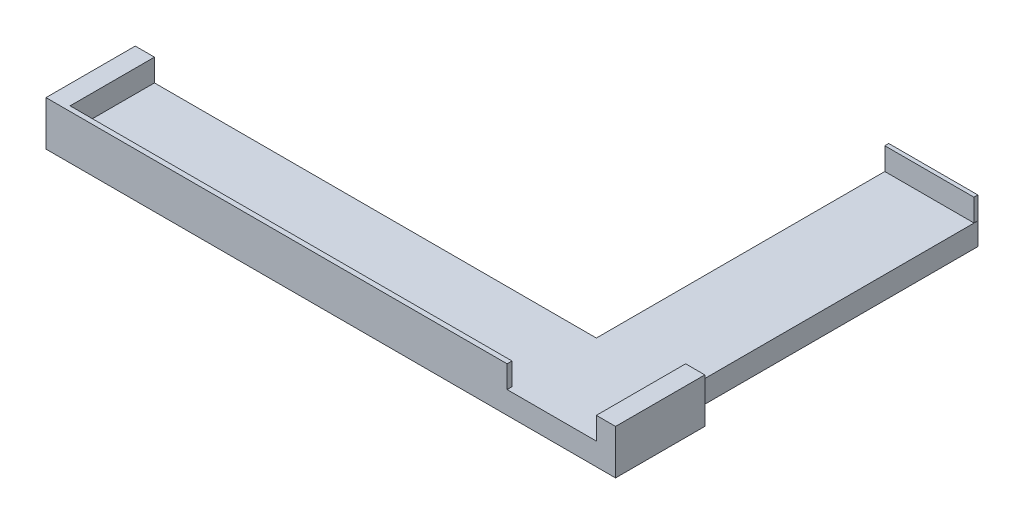
ISO-10303-21;
HEADER;
FILE_DESCRIPTION(('STEP AP214'),'2;1');
FILE_NAME('part.step','',(''),(''),'','','');
FILE_SCHEMA(('AUTOMOTIVE_DESIGN { 1 0 10303 214 1 1 1 1 }'));
ENDSEC;
DATA;
#1=APPLICATION_CONTEXT('core data for automotive mechanical design processes');
#2=APPLICATION_PROTOCOL_DEFINITION('international standard','automotive_design',2000,#1);
#3=PRODUCT_CONTEXT('',#1,'mechanical');
#4=PRODUCT('Part','Part','',(#3));
#5=PRODUCT_RELATED_PRODUCT_CATEGORY('part','',(#4));
#6=PRODUCT_DEFINITION_FORMATION('','',#4);
#7=PRODUCT_DEFINITION_CONTEXT('part definition',#1,'design');
#8=PRODUCT_DEFINITION('design','',#6,#7);
#9=PRODUCT_DEFINITION_SHAPE('','',#8);
#10=(LENGTH_UNIT() NAMED_UNIT(*) SI_UNIT(.MILLI.,.METRE.));
#11=(NAMED_UNIT(*) PLANE_ANGLE_UNIT() SI_UNIT($,.RADIAN.));
#12=(NAMED_UNIT(*) SI_UNIT($,.STERADIAN.) SOLID_ANGLE_UNIT());
#13=UNCERTAINTY_MEASURE_WITH_UNIT(LENGTH_MEASURE(1.E-05),#10,'distance_accuracy_value','');
#14=(GEOMETRIC_REPRESENTATION_CONTEXT(3) GLOBAL_UNCERTAINTY_ASSIGNED_CONTEXT((#13)) GLOBAL_UNIT_ASSIGNED_CONTEXT((#10,
#11,#12)) REPRESENTATION_CONTEXT('',''));
#15=CARTESIAN_POINT('',(0.,0.,0.));
#16=DIRECTION('',(0.,0.,1.));
#17=DIRECTION('',(1.,0.,0.));
#18=AXIS2_PLACEMENT_3D('',#15,#16,#17);
#19=CARTESIAN_POINT('',(59.5,5.,0.));
#20=DIRECTION('',(1.,0.,0.));
#21=DIRECTION('',(0.,0.,-1.));
#22=AXIS2_PLACEMENT_3D('',#19,#20,#21);
#23=PLANE('',#22);
#24=DIRECTION('',(0.,0.,1.));
#25=VECTOR('',#24,1.);
#26=CARTESIAN_POINT('',(59.5,5.,0.));
#27=LINE('',#26,#25);
#28=CARTESIAN_POINT('',(59.5,5.,-75.5));
#29=VERTEX_POINT('',#28);
#30=CARTESIAN_POINT('',(59.5,5.,-10.));
#31=VERTEX_POINT('',#30);
#32=EDGE_CURVE('E228',#29,#31,#27,.T.);
#33=ORIENTED_EDGE('',*,*,#32,.T.);
#34=DIRECTION('',(0.,-1.,0.));
#35=VECTOR('',#34,1.);
#36=CARTESIAN_POINT('',(59.5,10.,-10.));
#37=LINE('',#36,#35);
#38=CARTESIAN_POINT('',(59.5,0.,-10.));
#39=VERTEX_POINT('',#38);
#40=EDGE_CURVE('E11',#31,#39,#37,.T.);
#41=ORIENTED_EDGE('',*,*,#40,.T.);
#42=DIRECTION('',(0.,0.,1.));
#43=VECTOR('',#42,1.);
#44=CARTESIAN_POINT('',(59.5,0.,0.));
#45=LINE('',#44,#43);
#46=CARTESIAN_POINT('',(59.5,0.,-75.5));
#47=VERTEX_POINT('',#46);
#48=EDGE_CURVE('E216',#47,#39,#45,.T.);
#49=ORIENTED_EDGE('',*,*,#48,.F.);
#50=DIRECTION('',(0.,-1.,0.));
#51=VECTOR('',#50,1.);
#52=CARTESIAN_POINT('',(59.5,5.,-75.5));
#53=LINE('',#52,#51);
#54=EDGE_CURVE('E253',#29,#47,#53,.T.);
#55=ORIENTED_EDGE('',*,*,#54,.F.);
#56=EDGE_LOOP('',(#33,#41,#49,#55));
#57=FACE_BOUND('',#56,.T.);
#58=ADVANCED_FACE('F41',(#57),#23,.T.);
#59=CARTESIAN_POINT('',(-59.5,10.,0.));
#60=DIRECTION('',(1.,0.,0.));
#61=DIRECTION('',(0.,0.,-1.));
#62=AXIS2_PLACEMENT_3D('',#59,#60,#61);
#63=PLANE('',#62);
#64=DIRECTION('',(0.,0.,1.));
#65=VECTOR('',#64,1.);
#66=CARTESIAN_POINT('',(-59.5,5.,0.));
#67=LINE('',#66,#65);
#68=CARTESIAN_POINT('',(-59.5,5.,-10.));
#69=VERTEX_POINT('',#68);
#70=CARTESIAN_POINT('',(-59.5,5.,8.90022315167097));
#71=VERTEX_POINT('',#70);
#72=EDGE_CURVE('E65',#69,#71,#67,.T.);
#73=ORIENTED_EDGE('',*,*,#72,.F.);
#74=DIRECTION('',(0.,-1.,0.));
#75=VECTOR('',#74,1.);
#76=CARTESIAN_POINT('',(-59.5,10.,-10.));
#77=LINE('',#76,#75);
#78=CARTESIAN_POINT('',(-59.5,10.,-10.));
#79=VERTEX_POINT('',#78);
#80=EDGE_CURVE('E45',#79,#69,#77,.T.);
#81=ORIENTED_EDGE('',*,*,#80,.F.);
#82=DIRECTION('',(0.,0.,1.));
#83=VECTOR('',#82,1.);
#84=CARTESIAN_POINT('',(-59.5,10.,0.));
#85=LINE('',#84,#83);
#86=CARTESIAN_POINT('',(-59.5,10.,8.90022315167097));
#87=VERTEX_POINT('',#86);
#88=EDGE_CURVE('E256',#79,#87,#85,.T.);
#89=ORIENTED_EDGE('',*,*,#88,.T.);
#90=DIRECTION('',(0.,-1.,0.));
#91=VECTOR('',#90,1.);
#92=CARTESIAN_POINT('',(-59.5,10.,8.90022315167097));
#93=LINE('',#92,#91);
#94=EDGE_CURVE('E273',#87,#71,#93,.T.);
#95=ORIENTED_EDGE('',*,*,#94,.T.);
#96=EDGE_LOOP('',(#73,#81,#89,#95));
#97=FACE_BOUND('',#96,.T.);
#98=ADVANCED_FACE('F43',(#97),#63,.T.);
#99=CARTESIAN_POINT('',(0.,10.,-10.));
#100=DIRECTION('',(0.,0.,-1.));
#101=DIRECTION('',(-1.,0.,0.));
#102=AXIS2_PLACEMENT_3D('',#99,#100,#101);
#103=PLANE('',#102);
#104=DIRECTION('',(1.,0.,0.));
#105=VECTOR('',#104,1.);
#106=CARTESIAN_POINT('',(0.,0.,-10.));
#107=LINE('',#106,#105);
#108=CARTESIAN_POINT('',(-63.8,0.,-10.));
#109=VERTEX_POINT('',#108);
#110=CARTESIAN_POINT('',(39.5,0.,-10.));
#111=VERTEX_POINT('',#110);
#112=EDGE_CURVE('E255',#109,#111,#107,.T.);
#113=ORIENTED_EDGE('',*,*,#112,.F.);
#114=DIRECTION('',(0.,-1.,0.));
#115=VECTOR('',#114,1.);
#116=CARTESIAN_POINT('',(-63.8,10.,-10.));
#117=LINE('',#116,#115);
#118=CARTESIAN_POINT('',(-63.8,10.,-10.));
#119=VERTEX_POINT('',#118);
#120=EDGE_CURVE('E286',#119,#109,#117,.T.);
#121=ORIENTED_EDGE('',*,*,#120,.F.);
#122=DIRECTION('',(1.,0.,0.));
#123=VECTOR('',#122,1.);
#124=CARTESIAN_POINT('',(0.,10.,-10.));
#125=LINE('',#124,#123);
#126=EDGE_CURVE('E259',#119,#79,#125,.T.);
#127=ORIENTED_EDGE('',*,*,#126,.T.);
#128=ORIENTED_EDGE('',*,*,#80,.T.);
#129=DIRECTION('',(1.,0.,0.));
#130=VECTOR('',#129,1.);
#131=CARTESIAN_POINT('',(0.,5.,-10.));
#132=LINE('',#131,#130);
#133=CARTESIAN_POINT('',(39.5,5.,-10.));
#134=VERTEX_POINT('',#133);
#135=EDGE_CURVE('E240',#69,#134,#132,.T.);
#136=ORIENTED_EDGE('',*,*,#135,.T.);
#137=DIRECTION('',(0.,-1.,0.));
#138=VECTOR('',#137,1.);
#139=CARTESIAN_POINT('',(39.5,5.,-10.));
#140=LINE('',#139,#138);
#141=EDGE_CURVE('E243',#134,#111,#140,.T.);
#142=ORIENTED_EDGE('',*,*,#141,.T.);
#143=EDGE_LOOP('',(#113,#121,#127,#128,#136,#142));
#144=FACE_BOUND('',#143,.T.);
#145=ADVANCED_FACE('F292',(#144),#103,.T.);
#146=CARTESIAN_POINT('',(-63.8,10.,0.));
#147=DIRECTION('',(-1.,0.,0.));
#148=DIRECTION('',(0.,0.,1.));
#149=AXIS2_PLACEMENT_3D('',#146,#147,#148);
#150=PLANE('',#149);
#151=DIRECTION('',(0.,0.,-1.));
#152=VECTOR('',#151,1.);
#153=CARTESIAN_POINT('',(-63.8,0.,0.));
#154=LINE('',#153,#152);
#155=CARTESIAN_POINT('',(-63.8,0.,10.));
#156=VERTEX_POINT('',#155);
#157=EDGE_CURVE('E275',#156,#109,#154,.T.);
#158=ORIENTED_EDGE('',*,*,#157,.F.);
#159=DIRECTION('',(0.,-1.,0.));
#160=VECTOR('',#159,1.);
#161=CARTESIAN_POINT('',(-63.8,10.,10.));
#162=LINE('',#161,#160);
#163=CARTESIAN_POINT('',(-63.8,10.,10.));
#164=VERTEX_POINT('',#163);
#165=EDGE_CURVE('E285',#164,#156,#162,.T.);
#166=ORIENTED_EDGE('',*,*,#165,.F.);
#167=DIRECTION('',(0.,0.,-1.));
#168=VECTOR('',#167,1.);
#169=CARTESIAN_POINT('',(-63.8,10.,0.));
#170=LINE('',#169,#168);
#171=EDGE_CURVE('E263',#164,#119,#170,.T.);
#172=ORIENTED_EDGE('',*,*,#171,.T.);
#173=ORIENTED_EDGE('',*,*,#120,.T.);
#174=EDGE_LOOP('',(#158,#166,#172,#173));
#175=FACE_BOUND('',#174,.T.);
#176=ADVANCED_FACE('F310',(#175),#150,.T.);
#177=CARTESIAN_POINT('',(0.,10.,10.));
#178=DIRECTION('',(0.,0.,-1.));
#179=DIRECTION('',(-1.,0.,0.));
#180=AXIS2_PLACEMENT_3D('',#177,#178,#179);
#181=PLANE('',#180);
#182=DIRECTION('',(1.,0.,0.));
#183=VECTOR('',#182,1.);
#184=CARTESIAN_POINT('',(0.,0.,10.));
#185=LINE('',#184,#183);
#186=CARTESIAN_POINT('',(63.8,0.,10.));
#187=VERTEX_POINT('',#186);
#188=EDGE_CURVE('E260',#156,#187,#185,.T.);
#189=ORIENTED_EDGE('',*,*,#188,.T.);
#190=DIRECTION('',(0.,-1.,0.));
#191=VECTOR('',#190,1.);
#192=CARTESIAN_POINT('',(63.8,10.,10.));
#193=LINE('',#192,#191);
#194=CARTESIAN_POINT('',(63.8,10.,10.));
#195=VERTEX_POINT('',#194);
#196=EDGE_CURVE('E209',#195,#187,#193,.T.);
#197=ORIENTED_EDGE('',*,*,#196,.F.);
#198=DIRECTION('',(1.,0.,0.));
#199=VECTOR('',#198,1.);
#200=CARTESIAN_POINT('',(0.,10.,10.));
#201=LINE('',#200,#199);
#202=CARTESIAN_POINT('',(59.5,10.,10.));
#203=VERTEX_POINT('',#202);
#204=EDGE_CURVE('E200',#203,#195,#201,.T.);
#205=ORIENTED_EDGE('',*,*,#204,.F.);
#206=DIRECTION('',(0.,-1.,0.));
#207=VECTOR('',#206,1.);
#208=CARTESIAN_POINT('',(59.5,10.,10.));
#209=LINE('',#208,#207);
#210=CARTESIAN_POINT('',(59.5,5.,10.));
#211=VERTEX_POINT('',#210);
#212=EDGE_CURVE('E212',#203,#211,#209,.T.);
#213=ORIENTED_EDGE('',*,*,#212,.T.);
#214=DIRECTION('',(1.,0.,0.));
#215=VECTOR('',#214,1.);
#216=CARTESIAN_POINT('',(0.,5.,10.));
#217=LINE('',#216,#215);
#218=CARTESIAN_POINT('',(39.5,5.,10.));
#219=VERTEX_POINT('',#218);
#220=EDGE_CURVE('E224',#219,#211,#217,.T.);
#221=ORIENTED_EDGE('',*,*,#220,.F.);
#222=DIRECTION('',(0.,-1.,0.));
#223=VECTOR('',#222,1.);
#224=CARTESIAN_POINT('',(39.5,10.,10.));
#225=LINE('',#224,#223);
#226=CARTESIAN_POINT('',(39.5,10.,10.));
#227=VERTEX_POINT('',#226);
#228=EDGE_CURVE('E283',#227,#219,#225,.T.);
#229=ORIENTED_EDGE('',*,*,#228,.F.);
#230=DIRECTION('',(1.,0.,0.));
#231=VECTOR('',#230,1.);
#232=CARTESIAN_POINT('',(0.,10.,10.));
#233=LINE('',#232,#231);
#234=EDGE_CURVE('E266',#164,#227,#233,.T.);
#235=ORIENTED_EDGE('',*,*,#234,.F.);
#236=ORIENTED_EDGE('',*,*,#165,.T.);
#237=EDGE_LOOP('',(#189,#197,#205,#213,#221,#229,#235,#236));
#238=FACE_BOUND('',#237,.T.);
#239=ADVANCED_FACE('F314',(#238),#181,.F.);
#240=CARTESIAN_POINT('',(39.5,10.,0.));
#241=DIRECTION('',(-1.,0.,0.));
#242=DIRECTION('',(0.,0.,1.));
#243=AXIS2_PLACEMENT_3D('',#240,#241,#242);
#244=PLANE('',#243);
#245=ORIENTED_EDGE('',*,*,#228,.T.);
#246=DIRECTION('',(0.,0.,-1.));
#247=VECTOR('',#246,1.);
#248=CARTESIAN_POINT('',(39.5,5.,0.));
#249=LINE('',#248,#247);
#250=CARTESIAN_POINT('',(39.5,5.,8.90022315167097));
#251=VERTEX_POINT('',#250);
#252=EDGE_CURVE('E222',#219,#251,#249,.T.);
#253=ORIENTED_EDGE('',*,*,#252,.T.);
#254=DIRECTION('',(0.,-1.,0.));
#255=VECTOR('',#254,1.);
#256=CARTESIAN_POINT('',(39.5,10.,8.90022315167097));
#257=LINE('',#256,#255);
#258=CARTESIAN_POINT('',(39.5,10.,8.90022315167097));
#259=VERTEX_POINT('',#258);
#260=EDGE_CURVE('E280',#259,#251,#257,.T.);
#261=ORIENTED_EDGE('',*,*,#260,.F.);
#262=DIRECTION('',(0.,0.,-1.));
#263=VECTOR('',#262,1.);
#264=CARTESIAN_POINT('',(39.5,10.,0.));
#265=LINE('',#264,#263);
#266=EDGE_CURVE('E268',#227,#259,#265,.T.);
#267=ORIENTED_EDGE('',*,*,#266,.F.);
#268=EDGE_LOOP('',(#245,#253,#261,#267));
#269=FACE_BOUND('',#268,.T.);
#270=ADVANCED_FACE('F319',(#269),#244,.F.);
#271=CARTESIAN_POINT('',(0.,10.,8.90022315167097));
#272=DIRECTION('',(0.,0.,-1.));
#273=DIRECTION('',(-1.,0.,0.));
#274=AXIS2_PLACEMENT_3D('',#271,#272,#273);
#275=PLANE('',#274);
#276=DIRECTION('',(1.,0.,0.));
#277=VECTOR('',#276,1.);
#278=CARTESIAN_POINT('',(0.,5.,8.90022315167097));
#279=LINE('',#278,#277);
#280=EDGE_CURVE('E218',#71,#251,#279,.T.);
#281=ORIENTED_EDGE('',*,*,#280,.F.);
#282=ORIENTED_EDGE('',*,*,#94,.F.);
#283=DIRECTION('',(1.,0.,0.));
#284=VECTOR('',#283,1.);
#285=CARTESIAN_POINT('',(0.,10.,8.90022315167097));
#286=LINE('',#285,#284);
#287=EDGE_CURVE('E270',#87,#259,#286,.T.);
#288=ORIENTED_EDGE('',*,*,#287,.T.);
#289=ORIENTED_EDGE('',*,*,#260,.T.);
#290=EDGE_LOOP('',(#281,#282,#288,#289));
#291=FACE_BOUND('',#290,.T.);
#292=ADVANCED_FACE('F322',(#291),#275,.T.);
#293=CARTESIAN_POINT('',(0.,10.,0.));
#294=DIRECTION('',(0.,1.,0.));
#295=DIRECTION('',(0.,0.,1.));
#296=AXIS2_PLACEMENT_3D('',#293,#294,#295);
#297=PLANE('',#296);
#298=ORIENTED_EDGE('',*,*,#88,.F.);
#299=ORIENTED_EDGE('',*,*,#126,.F.);
#300=ORIENTED_EDGE('',*,*,#171,.F.);
#301=ORIENTED_EDGE('',*,*,#234,.T.);
#302=ORIENTED_EDGE('',*,*,#266,.T.);
#303=ORIENTED_EDGE('',*,*,#287,.F.);
#304=EDGE_LOOP('',(#298,#299,#300,#301,#302,#303));
#305=FACE_BOUND('',#304,.T.);
#306=ADVANCED_FACE('F308',(#305),#297,.T.);
#307=CARTESIAN_POINT('',(0.,0.,0.));
#308=DIRECTION('',(0.,1.,0.));
#309=DIRECTION('',(0.,0.,1.));
#310=AXIS2_PLACEMENT_3D('',#307,#308,#309);
#311=PLANE('',#310);
#312=ORIENTED_EDGE('',*,*,#112,.T.);
#313=DIRECTION('',(0.,0.,-1.));
#314=VECTOR('',#313,1.);
#315=CARTESIAN_POINT('',(39.5,0.,0.));
#316=LINE('',#315,#314);
#317=CARTESIAN_POINT('',(39.5,0.,-75.5));
#318=VERTEX_POINT('',#317);
#319=EDGE_CURVE('E219',#111,#318,#316,.T.);
#320=ORIENTED_EDGE('',*,*,#319,.T.);
#321=DIRECTION('',(1.,0.,0.));
#322=VECTOR('',#321,1.);
#323=CARTESIAN_POINT('',(0.,0.,-75.5));
#324=LINE('',#323,#322);
#325=EDGE_CURVE('E246',#318,#47,#324,.T.);
#326=ORIENTED_EDGE('',*,*,#325,.T.);
#327=ORIENTED_EDGE('',*,*,#48,.T.);
#328=DIRECTION('',(1.,0.,0.));
#329=VECTOR('',#328,1.);
#330=CARTESIAN_POINT('',(0.,0.,-10.));
#331=LINE('',#330,#329);
#332=CARTESIAN_POINT('',(63.8,0.,-10.));
#333=VERTEX_POINT('',#332);
#334=EDGE_CURVE('E58',#39,#333,#331,.T.);
#335=ORIENTED_EDGE('',*,*,#334,.T.);
#336=DIRECTION('',(0.,0.,-1.));
#337=VECTOR('',#336,1.);
#338=CARTESIAN_POINT('',(63.8,0.,0.));
#339=LINE('',#338,#337);
#340=EDGE_CURVE('E198',#187,#333,#339,.T.);
#341=ORIENTED_EDGE('',*,*,#340,.F.);
#342=ORIENTED_EDGE('',*,*,#188,.F.);
#343=ORIENTED_EDGE('',*,*,#157,.T.);
#344=EDGE_LOOP('',(#312,#320,#326,#327,#335,#341,#342,#343));
#345=FACE_BOUND('',#344,.T.);
#346=ADVANCED_FACE('F304',(#345),#311,.F.);
#347=CARTESIAN_POINT('',(0.,5.,-75.5));
#348=DIRECTION('',(0.,0.,-1.));
#349=DIRECTION('',(-1.,0.,0.));
#350=AXIS2_PLACEMENT_3D('',#347,#348,#349);
#351=PLANE('',#350);
#352=ORIENTED_EDGE('',*,*,#325,.F.);
#353=DIRECTION('',(0.,-1.,0.));
#354=VECTOR('',#353,1.);
#355=CARTESIAN_POINT('',(39.5,10.,-75.5));
#356=LINE('',#355,#354);
#357=CARTESIAN_POINT('',(39.5,10.,-75.5));
#358=VERTEX_POINT('',#357);
#359=EDGE_CURVE('E169',#358,#318,#356,.T.);
#360=ORIENTED_EDGE('',*,*,#359,.F.);
#361=DIRECTION('',(1.,0.,0.));
#362=VECTOR('',#361,1.);
#363=CARTESIAN_POINT('',(0.,10.,-75.5));
#364=LINE('',#363,#362);
#365=CARTESIAN_POINT('',(59.4687435036804,10.,-75.5));
#366=VERTEX_POINT('',#365);
#367=EDGE_CURVE('E175',#358,#366,#364,.T.);
#368=ORIENTED_EDGE('',*,*,#367,.T.);
#369=DIRECTION('',(0.,-1.,0.));
#370=VECTOR('',#369,1.);
#371=CARTESIAN_POINT('',(59.4687435036804,10.,-75.5));
#372=LINE('',#371,#370);
#373=CARTESIAN_POINT('',(59.4687435036804,5.,-75.5));
#374=VERTEX_POINT('',#373);
#375=EDGE_CURVE('E160',#366,#374,#372,.T.);
#376=ORIENTED_EDGE('',*,*,#375,.T.);
#377=DIRECTION('',(1.,0.,0.));
#378=VECTOR('',#377,1.);
#379=CARTESIAN_POINT('',(0.,5.,-75.5));
#380=LINE('',#379,#378);
#381=EDGE_CURVE('E231',#374,#29,#380,.T.);
#382=ORIENTED_EDGE('',*,*,#381,.T.);
#383=ORIENTED_EDGE('',*,*,#54,.T.);
#384=EDGE_LOOP('',(#352,#360,#368,#376,#382,#383));
#385=FACE_BOUND('',#384,.T.);
#386=ADVANCED_FACE('F181',(#385),#351,.T.);
#387=CARTESIAN_POINT('',(39.5,5.,0.));
#388=DIRECTION('',(-1.,0.,0.));
#389=DIRECTION('',(0.,0.,1.));
#390=AXIS2_PLACEMENT_3D('',#387,#388,#389);
#391=PLANE('',#390);
#392=ORIENTED_EDGE('',*,*,#319,.F.);
#393=ORIENTED_EDGE('',*,*,#141,.F.);
#394=DIRECTION('',(0.,0.,-1.));
#395=VECTOR('',#394,1.);
#396=CARTESIAN_POINT('',(39.5,5.,0.));
#397=LINE('',#396,#395);
#398=CARTESIAN_POINT('',(39.5,5.,-74.6204127895139));
#399=VERTEX_POINT('',#398);
#400=EDGE_CURVE('E237',#134,#399,#397,.T.);
#401=ORIENTED_EDGE('',*,*,#400,.T.);
#402=DIRECTION('',(0.,-1.,0.));
#403=VECTOR('',#402,1.);
#404=CARTESIAN_POINT('',(39.5,10.,-74.6204127895139));
#405=LINE('',#404,#403);
#406=CARTESIAN_POINT('',(39.5,10.,-74.6204127895139));
#407=VERTEX_POINT('',#406);
#408=EDGE_CURVE('E190',#407,#399,#405,.T.);
#409=ORIENTED_EDGE('',*,*,#408,.F.);
#410=DIRECTION('',(0.,0.,-1.));
#411=VECTOR('',#410,1.);
#412=CARTESIAN_POINT('',(39.5,10.,0.));
#413=LINE('',#412,#411);
#414=EDGE_CURVE('E183',#407,#358,#413,.T.);
#415=ORIENTED_EDGE('',*,*,#414,.T.);
#416=ORIENTED_EDGE('',*,*,#359,.T.);
#417=EDGE_LOOP('',(#392,#393,#401,#409,#415,#416));
#418=FACE_BOUND('',#417,.T.);
#419=ADVANCED_FACE('F300',(#418),#391,.T.);
#420=CARTESIAN_POINT('',(0.,5.,0.));
#421=DIRECTION('',(0.,1.,0.));
#422=DIRECTION('',(0.,0.,1.));
#423=AXIS2_PLACEMENT_3D('',#420,#421,#422);
#424=PLANE('',#423);
#425=ORIENTED_EDGE('',*,*,#72,.T.);
#426=ORIENTED_EDGE('',*,*,#280,.T.);
#427=ORIENTED_EDGE('',*,*,#252,.F.);
#428=ORIENTED_EDGE('',*,*,#220,.T.);
#429=EDGE_CURVE('E227',#31,#211,#27,.T.);
#430=ORIENTED_EDGE('',*,*,#429,.F.);
#431=ORIENTED_EDGE('',*,*,#32,.F.);
#432=ORIENTED_EDGE('',*,*,#381,.F.);
#433=DIRECTION('',(0.,0.,1.));
#434=VECTOR('',#433,1.);
#435=CARTESIAN_POINT('',(59.4687435036804,5.,0.));
#436=LINE('',#435,#434);
#437=CARTESIAN_POINT('',(59.4687435036804,5.,-74.6204127895139));
#438=VERTEX_POINT('',#437);
#439=EDGE_CURVE('E165',#374,#438,#436,.T.);
#440=ORIENTED_EDGE('',*,*,#439,.T.);
#441=DIRECTION('',(1.,0.,0.));
#442=VECTOR('',#441,1.);
#443=CARTESIAN_POINT('',(0.,5.,-74.6204127895139));
#444=LINE('',#443,#442);
#445=EDGE_CURVE('E234',#399,#438,#444,.T.);
#446=ORIENTED_EDGE('',*,*,#445,.F.);
#447=ORIENTED_EDGE('',*,*,#400,.F.);
#448=ORIENTED_EDGE('',*,*,#135,.F.);
#449=EDGE_LOOP('',(#425,#426,#427,#428,#430,#431,#432,#440,#446,#447,#448));
#450=FACE_BOUND('',#449,.T.);
#451=ADVANCED_FACE('F297',(#450),#424,.T.);
#452=CARTESIAN_POINT('',(59.5,10.,0.));
#453=DIRECTION('',(1.,0.,0.));
#454=DIRECTION('',(0.,0.,-1.));
#455=AXIS2_PLACEMENT_3D('',#452,#453,#454);
#456=PLANE('',#455);
#457=CARTESIAN_POINT('',(59.5,10.,-10.));
#458=VERTEX_POINT('',#457);
#459=EDGE_CURVE('E51',#458,#31,#37,.T.);
#460=ORIENTED_EDGE('',*,*,#459,.T.);
#461=ORIENTED_EDGE('',*,*,#429,.T.);
#462=ORIENTED_EDGE('',*,*,#212,.F.);
#463=DIRECTION('',(0.,0.,1.));
#464=VECTOR('',#463,1.);
#465=CARTESIAN_POINT('',(59.5,10.,0.));
#466=LINE('',#465,#464);
#467=EDGE_CURVE('E197',#458,#203,#466,.T.);
#468=ORIENTED_EDGE('',*,*,#467,.F.);
#469=EDGE_LOOP('',(#460,#461,#462,#468));
#470=FACE_BOUND('',#469,.T.);
#471=ADVANCED_FACE('F386',(#470),#456,.F.);
#472=CARTESIAN_POINT('',(0.,10.,-10.));
#473=DIRECTION('',(0.,0.,-1.));
#474=DIRECTION('',(-1.,0.,0.));
#475=AXIS2_PLACEMENT_3D('',#472,#473,#474);
#476=PLANE('',#475);
#477=ORIENTED_EDGE('',*,*,#334,.F.);
#478=ORIENTED_EDGE('',*,*,#40,.F.);
#479=ORIENTED_EDGE('',*,*,#459,.F.);
#480=DIRECTION('',(1.,0.,0.));
#481=VECTOR('',#480,1.);
#482=CARTESIAN_POINT('',(0.,10.,-10.));
#483=LINE('',#482,#481);
#484=CARTESIAN_POINT('',(63.8,10.,-10.));
#485=VERTEX_POINT('',#484);
#486=EDGE_CURVE('E194',#458,#485,#483,.T.);
#487=ORIENTED_EDGE('',*,*,#486,.T.);
#488=DIRECTION('',(0.,-1.,0.));
#489=VECTOR('',#488,1.);
#490=CARTESIAN_POINT('',(63.8,10.,-10.));
#491=LINE('',#490,#489);
#492=EDGE_CURVE('E204',#485,#333,#491,.T.);
#493=ORIENTED_EDGE('',*,*,#492,.T.);
#494=EDGE_LOOP('',(#477,#478,#479,#487,#493));
#495=FACE_BOUND('',#494,.T.);
#496=ADVANCED_FACE('F393',(#495),#476,.T.);
#497=CARTESIAN_POINT('',(63.8,10.,0.));
#498=DIRECTION('',(-1.,0.,0.));
#499=DIRECTION('',(0.,0.,1.));
#500=AXIS2_PLACEMENT_3D('',#497,#498,#499);
#501=PLANE('',#500);
#502=ORIENTED_EDGE('',*,*,#340,.T.);
#503=ORIENTED_EDGE('',*,*,#492,.F.);
#504=DIRECTION('',(0.,0.,-1.));
#505=VECTOR('',#504,1.);
#506=CARTESIAN_POINT('',(63.8,10.,0.));
#507=LINE('',#506,#505);
#508=EDGE_CURVE('E202',#195,#485,#507,.T.);
#509=ORIENTED_EDGE('',*,*,#508,.F.);
#510=ORIENTED_EDGE('',*,*,#196,.T.);
#511=EDGE_LOOP('',(#502,#503,#509,#510));
#512=FACE_BOUND('',#511,.T.);
#513=ADVANCED_FACE('F401',(#512),#501,.F.);
#514=CARTESIAN_POINT('',(0.,10.,0.));
#515=DIRECTION('',(0.,1.,0.));
#516=DIRECTION('',(0.,0.,1.));
#517=AXIS2_PLACEMENT_3D('',#514,#515,#516);
#518=PLANE('',#517);
#519=ORIENTED_EDGE('',*,*,#486,.F.);
#520=ORIENTED_EDGE('',*,*,#467,.T.);
#521=ORIENTED_EDGE('',*,*,#204,.T.);
#522=ORIENTED_EDGE('',*,*,#508,.T.);
#523=EDGE_LOOP('',(#519,#520,#521,#522));
#524=FACE_BOUND('',#523,.T.);
#525=ADVANCED_FACE('F408',(#524),#518,.T.);
#526=CARTESIAN_POINT('',(59.4687435036804,10.,0.));
#527=DIRECTION('',(1.,0.,0.));
#528=DIRECTION('',(0.,0.,-1.));
#529=AXIS2_PLACEMENT_3D('',#526,#527,#528);
#530=PLANE('',#529);
#531=DIRECTION('',(0.,-1.,0.));
#532=VECTOR('',#531,1.);
#533=CARTESIAN_POINT('',(59.4687435036804,10.,-74.6204127895139));
#534=LINE('',#533,#532);
#535=CARTESIAN_POINT('',(59.4687435036804,10.,-74.6204127895139));
#536=VERTEX_POINT('',#535);
#537=EDGE_CURVE('E188',#536,#438,#534,.T.);
#538=ORIENTED_EDGE('',*,*,#537,.T.);
#539=ORIENTED_EDGE('',*,*,#439,.F.);
#540=ORIENTED_EDGE('',*,*,#375,.F.);
#541=DIRECTION('',(0.,0.,1.));
#542=VECTOR('',#541,1.);
#543=CARTESIAN_POINT('',(59.4687435036804,10.,0.));
#544=LINE('',#543,#542);
#545=EDGE_CURVE('E164',#366,#536,#544,.T.);
#546=ORIENTED_EDGE('',*,*,#545,.T.);
#547=EDGE_LOOP('',(#538,#539,#540,#546));
#548=FACE_BOUND('',#547,.T.);
#549=ADVANCED_FACE('F163',(#548),#530,.T.);
#550=CARTESIAN_POINT('',(0.,10.,-74.6204127895139));
#551=DIRECTION('',(0.,0.,-1.));
#552=DIRECTION('',(-1.,0.,0.));
#553=AXIS2_PLACEMENT_3D('',#550,#551,#552);
#554=PLANE('',#553);
#555=ORIENTED_EDGE('',*,*,#445,.T.);
#556=ORIENTED_EDGE('',*,*,#537,.F.);
#557=DIRECTION('',(1.,0.,0.));
#558=VECTOR('',#557,1.);
#559=CARTESIAN_POINT('',(0.,10.,-74.6204127895139));
#560=LINE('',#559,#558);
#561=EDGE_CURVE('E178',#407,#536,#560,.T.);
#562=ORIENTED_EDGE('',*,*,#561,.F.);
#563=ORIENTED_EDGE('',*,*,#408,.T.);
#564=EDGE_LOOP('',(#555,#556,#562,#563));
#565=FACE_BOUND('',#564,.T.);
#566=ADVANCED_FACE('F302',(#565),#554,.F.);
#567=CARTESIAN_POINT('',(0.,10.,0.));
#568=DIRECTION('',(0.,1.,0.));
#569=DIRECTION('',(0.,0.,1.));
#570=AXIS2_PLACEMENT_3D('',#567,#568,#569);
#571=PLANE('',#570);
#572=ORIENTED_EDGE('',*,*,#545,.F.);
#573=ORIENTED_EDGE('',*,*,#367,.F.);
#574=ORIENTED_EDGE('',*,*,#414,.F.);
#575=ORIENTED_EDGE('',*,*,#561,.T.);
#576=EDGE_LOOP('',(#572,#573,#574,#575));
#577=FACE_BOUND('',#576,.T.);
#578=ADVANCED_FACE('F173',(#577),#571,.T.);
#579=CLOSED_SHELL('',(#58,#98,#145,#176,#239,#270,#292,#306,#346,#386,#419,#451,#471,#496,#513,
#525,#549,#566,#578));
#580=MANIFOLD_SOLID_BREP('B2',#579);
#581=ADVANCED_BREP_SHAPE_REPRESENTATION('',(#18,#580),#14);
#582=SHAPE_DEFINITION_REPRESENTATION(#9,#581);
ENDSEC;
END-ISO-10303-21;
